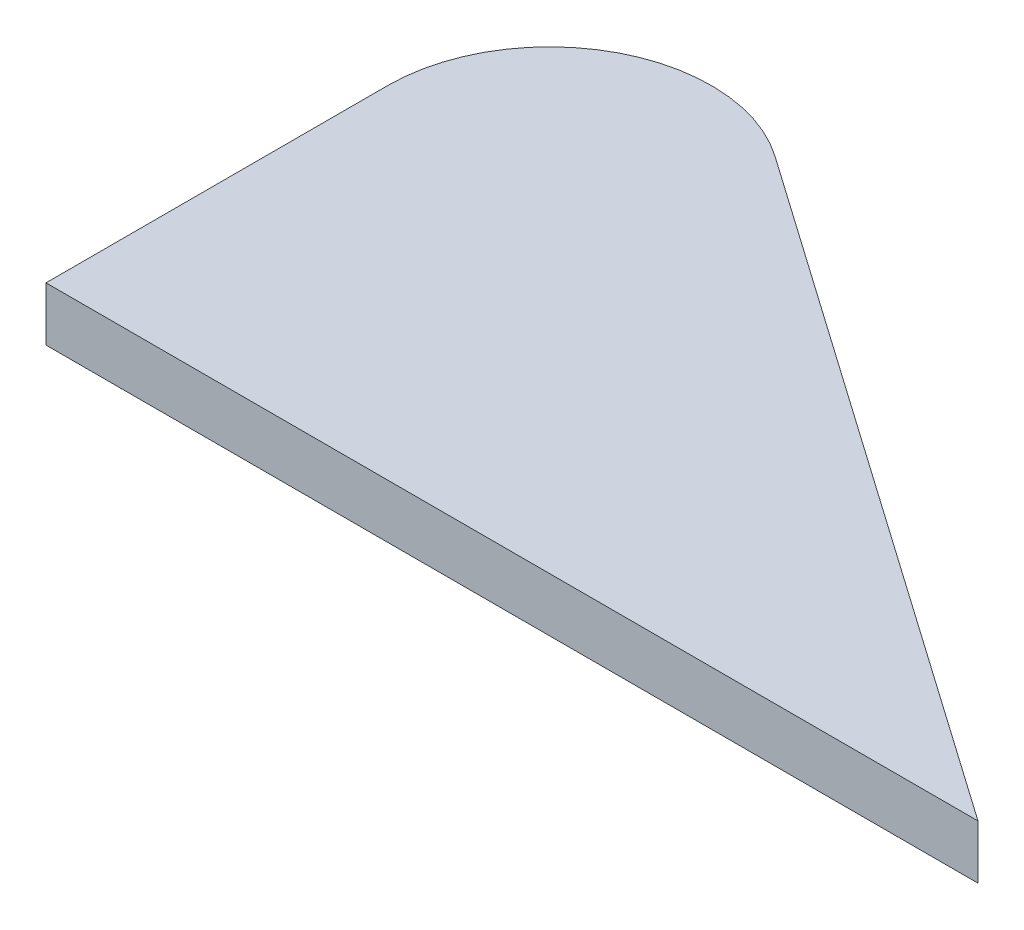
ISO-10303-21;
HEADER;
FILE_DESCRIPTION(('STEP AP214'),'2;1');
FILE_NAME('part.step','',(''),(''),'','','');
FILE_SCHEMA(('AUTOMOTIVE_DESIGN { 1 0 10303 214 1 1 1 1 }'));
ENDSEC;
DATA;
#1=APPLICATION_CONTEXT('core data for automotive mechanical design processes');
#2=APPLICATION_PROTOCOL_DEFINITION('international standard','automotive_design',2000,#1);
#3=PRODUCT_CONTEXT('',#1,'mechanical');
#4=PRODUCT('Part','Part','',(#3));
#5=PRODUCT_RELATED_PRODUCT_CATEGORY('part','',(#4));
#6=PRODUCT_DEFINITION_FORMATION('','',#4);
#7=PRODUCT_DEFINITION_CONTEXT('part definition',#1,'design');
#8=PRODUCT_DEFINITION('design','',#6,#7);
#9=PRODUCT_DEFINITION_SHAPE('','',#8);
#10=(LENGTH_UNIT() NAMED_UNIT(*) SI_UNIT(.MILLI.,.METRE.));
#11=(NAMED_UNIT(*) PLANE_ANGLE_UNIT() SI_UNIT($,.RADIAN.));
#12=(NAMED_UNIT(*) SI_UNIT($,.STERADIAN.) SOLID_ANGLE_UNIT());
#13=UNCERTAINTY_MEASURE_WITH_UNIT(LENGTH_MEASURE(1.E-05),#10,'distance_accuracy_value','');
#14=(GEOMETRIC_REPRESENTATION_CONTEXT(3) GLOBAL_UNCERTAINTY_ASSIGNED_CONTEXT((#13)) GLOBAL_UNIT_ASSIGNED_CONTEXT((#10,
#11,#12)) REPRESENTATION_CONTEXT('',''));
#15=CARTESIAN_POINT('',(0.,0.,0.));
#16=DIRECTION('',(0.,0.,1.));
#17=DIRECTION('',(1.,0.,0.));
#18=AXIS2_PLACEMENT_3D('',#15,#16,#17);
#19=CARTESIAN_POINT('',(109.737398428125,6.35,0.));
#20=DIRECTION('',(-0.573576436351041,0.,0.819152044288995));
#21=DIRECTION('',(0.819152044288995,0.,0.573576436351041));
#22=AXIS2_PLACEMENT_3D('',#19,#20,#21);
#23=PLANE('',#22);
#24=DIRECTION('',(-0.819152044288995,0.,-0.573576436351041));
#25=VECTOR('',#24,1.);
#26=CARTESIAN_POINT('',(109.737398428125,0.,0.));
#27=LINE('',#26,#25);
#28=CARTESIAN_POINT('',(109.737398428125,0.,0.));
#29=VERTEX_POINT('',#28);
#30=CARTESIAN_POINT('',(29.9766311124874,0.,-55.8490905277997));
#31=VERTEX_POINT('',#30);
#32=EDGE_CURVE('E94',#29,#31,#27,.T.);
#33=ORIENTED_EDGE('',*,*,#32,.T.);
#34=DIRECTION('',(0.,-1.,0.));
#35=VECTOR('',#34,1.);
#36=CARTESIAN_POINT('',(29.9766311124874,6.35,-55.8490905277997));
#37=LINE('',#36,#35);
#38=CARTESIAN_POINT('',(29.9766311124874,6.35,-55.8490905277997));
#39=VERTEX_POINT('',#38);
#40=EDGE_CURVE('E48',#39,#31,#37,.T.);
#41=ORIENTED_EDGE('',*,*,#40,.F.);
#42=DIRECTION('',(-0.819152044288995,0.,-0.573576436351041));
#43=VECTOR('',#42,1.);
#44=CARTESIAN_POINT('',(109.737398428125,6.35,0.));
#45=LINE('',#44,#43);
#46=CARTESIAN_POINT('',(109.737398428125,6.35,0.));
#47=VERTEX_POINT('',#46);
#48=EDGE_CURVE('E84',#47,#39,#45,.T.);
#49=ORIENTED_EDGE('',*,*,#48,.F.);
#50=DIRECTION('',(0.,-1.,0.));
#51=VECTOR('',#50,1.);
#52=CARTESIAN_POINT('',(109.737398428125,6.35,0.));
#53=LINE('',#52,#51);
#54=EDGE_CURVE('E11',#47,#29,#53,.T.);
#55=ORIENTED_EDGE('',*,*,#54,.T.);
#56=EDGE_LOOP('',(#33,#41,#49,#55));
#57=FACE_BOUND('',#56,.T.);
#58=ADVANCED_FACE('F39',(#57),#23,.F.);
#59=CARTESIAN_POINT('',(19.05,6.35,-40.2442440840944));
#60=DIRECTION('',(0.,-1.,0.));
#61=DIRECTION('',(0.,0.,-1.));
#62=AXIS2_PLACEMENT_3D('',#59,#60,#61);
#63=CYLINDRICAL_SURFACE('',#62,19.05);
#64=CARTESIAN_POINT('',(19.05,0.,-40.2442440840944));
#65=DIRECTION('',(0.,1.,0.));
#66=DIRECTION('',(0.,0.,1.));
#67=AXIS2_PLACEMENT_3D('',#64,#65,#66);
#68=CIRCLE('',#67,19.05);
#69=CARTESIAN_POINT('',(0.,0.,-40.2442440840944));
#70=VERTEX_POINT('',#69);
#71=EDGE_CURVE('E108',#31,#70,#68,.T.);
#72=ORIENTED_EDGE('',*,*,#71,.T.);
#73=DIRECTION('',(0.,-1.,0.));
#74=VECTOR('',#73,1.);
#75=CARTESIAN_POINT('',(0.,6.35,-40.2442440840944));
#76=LINE('',#75,#74);
#77=CARTESIAN_POINT('',(0.,6.35,-40.2442440840944));
#78=VERTEX_POINT('',#77);
#79=EDGE_CURVE('E74',#78,#70,#76,.T.);
#80=ORIENTED_EDGE('',*,*,#79,.F.);
#81=CARTESIAN_POINT('',(19.05,6.35,-40.2442440840944));
#82=DIRECTION('',(0.,1.,0.));
#83=DIRECTION('',(0.,0.,1.));
#84=AXIS2_PLACEMENT_3D('',#81,#82,#83);
#85=CIRCLE('',#84,19.05);
#86=EDGE_CURVE('E89',#39,#78,#85,.T.);
#87=ORIENTED_EDGE('',*,*,#86,.F.);
#88=ORIENTED_EDGE('',*,*,#40,.T.);
#89=EDGE_LOOP('',(#72,#80,#87,#88));
#90=FACE_BOUND('',#89,.T.);
#91=ADVANCED_FACE('F98',(#90),#63,.T.);
#92=CARTESIAN_POINT('',(0.,6.35,0.));
#93=DIRECTION('',(-1.,0.,0.));
#94=DIRECTION('',(0.,0.,1.));
#95=AXIS2_PLACEMENT_3D('',#92,#93,#94);
#96=PLANE('',#95);
#97=DIRECTION('',(0.,0.,-1.));
#98=VECTOR('',#97,1.);
#99=CARTESIAN_POINT('',(0.,0.,0.));
#100=LINE('',#99,#98);
#101=CARTESIAN_POINT('',(0.,0.,0.));
#102=VERTEX_POINT('',#101);
#103=EDGE_CURVE('E111',#102,#70,#100,.T.);
#104=ORIENTED_EDGE('',*,*,#103,.F.);
#105=DIRECTION('',(0.,-1.,0.));
#106=VECTOR('',#105,1.);
#107=CARTESIAN_POINT('',(0.,6.35,0.));
#108=LINE('',#107,#106);
#109=CARTESIAN_POINT('',(0.,6.35,0.));
#110=VERTEX_POINT('',#109);
#111=EDGE_CURVE('E77',#110,#102,#108,.T.);
#112=ORIENTED_EDGE('',*,*,#111,.F.);
#113=DIRECTION('',(0.,0.,-1.));
#114=VECTOR('',#113,1.);
#115=CARTESIAN_POINT('',(0.,6.35,0.));
#116=LINE('',#115,#114);
#117=EDGE_CURVE('E100',#110,#78,#116,.T.);
#118=ORIENTED_EDGE('',*,*,#117,.T.);
#119=ORIENTED_EDGE('',*,*,#79,.T.);
#120=EDGE_LOOP('',(#104,#112,#118,#119));
#121=FACE_BOUND('',#120,.T.);
#122=ADVANCED_FACE('F125',(#121),#96,.T.);
#123=CARTESIAN_POINT('',(0.,6.35,0.));
#124=DIRECTION('',(0.,0.,-1.));
#125=DIRECTION('',(-1.,0.,0.));
#126=AXIS2_PLACEMENT_3D('',#123,#124,#125);
#127=PLANE('',#126);
#128=DIRECTION('',(1.,0.,0.));
#129=VECTOR('',#128,1.);
#130=CARTESIAN_POINT('',(0.,0.,0.));
#131=LINE('',#130,#129);
#132=EDGE_CURVE('E115',#102,#29,#131,.T.);
#133=ORIENTED_EDGE('',*,*,#132,.T.);
#134=ORIENTED_EDGE('',*,*,#54,.F.);
#135=DIRECTION('',(1.,0.,0.));
#136=VECTOR('',#135,1.);
#137=CARTESIAN_POINT('',(19.05,6.35,0.));
#138=LINE('',#137,#136);
#139=EDGE_CURVE('E56',#110,#47,#138,.T.);
#140=ORIENTED_EDGE('',*,*,#139,.F.);
#141=ORIENTED_EDGE('',*,*,#111,.T.);
#142=EDGE_LOOP('',(#133,#134,#140,#141));
#143=FACE_BOUND('',#142,.T.);
#144=ADVANCED_FACE('F122',(#143),#127,.F.);
#145=CARTESIAN_POINT('',(19.05,6.35,-40.2442440840944));
#146=DIRECTION('',(0.,1.,0.));
#147=DIRECTION('',(0.,0.,1.));
#148=AXIS2_PLACEMENT_3D('',#145,#146,#147);
#149=PLANE('',#148);
#150=ORIENTED_EDGE('',*,*,#139,.T.);
#151=ORIENTED_EDGE('',*,*,#48,.T.);
#152=ORIENTED_EDGE('',*,*,#86,.T.);
#153=ORIENTED_EDGE('',*,*,#117,.F.);
#154=EDGE_LOOP('',(#150,#151,#152,#153));
#155=FACE_BOUND('',#154,.T.);
#156=ADVANCED_FACE('F86',(#155),#149,.T.);
#157=CARTESIAN_POINT('',(19.05,0.,-40.2442440840944));
#158=DIRECTION('',(0.,1.,0.));
#159=DIRECTION('',(0.,0.,1.));
#160=AXIS2_PLACEMENT_3D('',#157,#158,#159);
#161=PLANE('',#160);
#162=ORIENTED_EDGE('',*,*,#32,.F.);
#163=ORIENTED_EDGE('',*,*,#132,.F.);
#164=ORIENTED_EDGE('',*,*,#103,.T.);
#165=ORIENTED_EDGE('',*,*,#71,.F.);
#166=EDGE_LOOP('',(#162,#163,#164,#165));
#167=FACE_BOUND('',#166,.T.);
#168=ADVANCED_FACE('F124',(#167),#161,.F.);
#169=CLOSED_SHELL('',(#58,#91,#122,#144,#156,#168));
#170=MANIFOLD_SOLID_BREP('B2',#169);
#171=ADVANCED_BREP_SHAPE_REPRESENTATION('',(#18,#170),#14);
#172=SHAPE_DEFINITION_REPRESENTATION(#9,#171);
ENDSEC;
END-ISO-10303-21;
